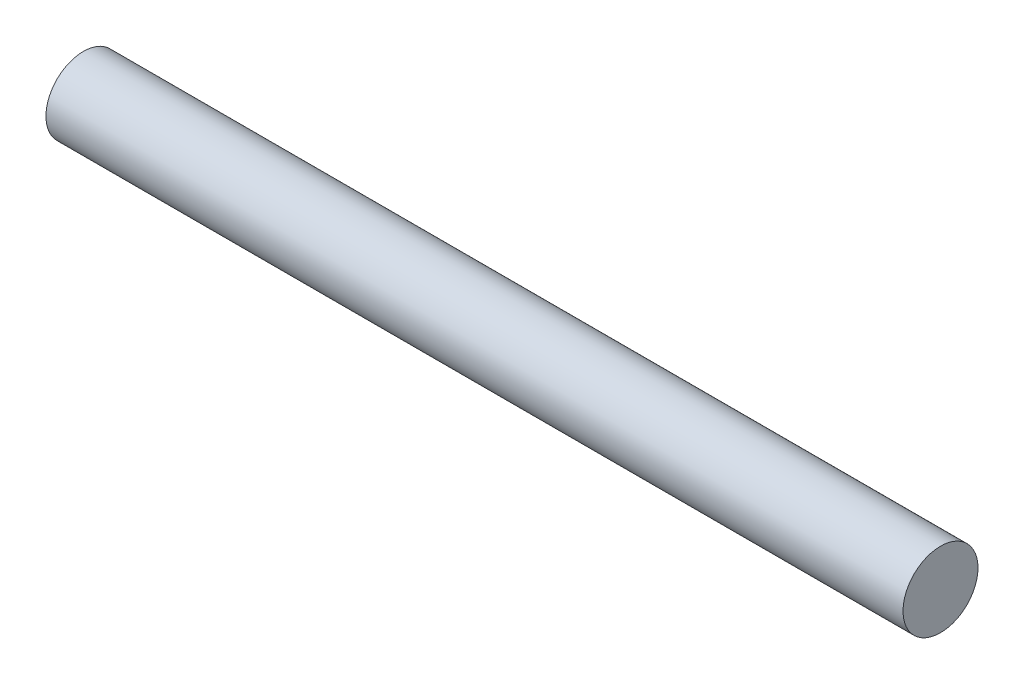
ISO-10303-21;
HEADER;
FILE_DESCRIPTION(('STEP AP214'),'2;1');
FILE_NAME('part.step','',(''),(''),'','','');
FILE_SCHEMA(('AUTOMOTIVE_DESIGN { 1 0 10303 214 1 1 1 1 }'));
ENDSEC;
DATA;
#1=APPLICATION_CONTEXT('core data for automotive mechanical design processes');
#2=APPLICATION_PROTOCOL_DEFINITION('international standard','automotive_design',2000,#1);
#3=PRODUCT_CONTEXT('',#1,'mechanical');
#4=PRODUCT('Part','Part','',(#3));
#5=PRODUCT_RELATED_PRODUCT_CATEGORY('part','',(#4));
#6=PRODUCT_DEFINITION_FORMATION('','',#4);
#7=PRODUCT_DEFINITION_CONTEXT('part definition',#1,'design');
#8=PRODUCT_DEFINITION('design','',#6,#7);
#9=PRODUCT_DEFINITION_SHAPE('','',#8);
#10=(LENGTH_UNIT() NAMED_UNIT(*) SI_UNIT(.MILLI.,.METRE.));
#11=(NAMED_UNIT(*) PLANE_ANGLE_UNIT() SI_UNIT($,.RADIAN.));
#12=(NAMED_UNIT(*) SI_UNIT($,.STERADIAN.) SOLID_ANGLE_UNIT());
#13=UNCERTAINTY_MEASURE_WITH_UNIT(LENGTH_MEASURE(1.E-05),#10,'distance_accuracy_value','');
#14=(GEOMETRIC_REPRESENTATION_CONTEXT(3) GLOBAL_UNCERTAINTY_ASSIGNED_CONTEXT((#13)) GLOBAL_UNIT_ASSIGNED_CONTEXT((#10,
#11,#12)) REPRESENTATION_CONTEXT('',''));
#15=CARTESIAN_POINT('',(0.,0.,0.));
#16=DIRECTION('',(0.,0.,1.));
#17=DIRECTION('',(1.,0.,0.));
#18=AXIS2_PLACEMENT_3D('',#15,#16,#17);
#19=CARTESIAN_POINT('',(57.15,0.,0.));
#20=DIRECTION('',(-1.,0.,0.));
#21=DIRECTION('',(0.,0.,1.));
#22=AXIS2_PLACEMENT_3D('',#19,#20,#21);
#23=CYLINDRICAL_SURFACE('',#22,2.5);
#24=CARTESIAN_POINT('',(57.15,0.,0.));
#25=DIRECTION('',(1.,0.,0.));
#26=DIRECTION('',(0.,0.,-1.));
#27=AXIS2_PLACEMENT_3D('',#24,#25,#26);
#28=CIRCLE('',#27,2.5);
#29=CARTESIAN_POINT('',(57.15,0.,-2.5));
#30=VERTEX_POINT('',#29);
#31=EDGE_CURVE('E10',#30,#30,#28,.T.);
#32=ORIENTED_EDGE('',*,*,#31,.F.);
#33=EDGE_LOOP('',(#32));
#34=FACE_BOUND('',#33,.T.);
#35=CARTESIAN_POINT('',(0.,0.,0.));
#36=DIRECTION('',(1.,0.,0.));
#37=DIRECTION('',(0.,0.,-1.));
#38=AXIS2_PLACEMENT_3D('',#35,#36,#37);
#39=CIRCLE('',#38,2.5);
#40=CARTESIAN_POINT('',(0.,0.,-2.5));
#41=VERTEX_POINT('',#40);
#42=EDGE_CURVE('E34',#41,#41,#39,.T.);
#43=ORIENTED_EDGE('',*,*,#42,.T.);
#44=EDGE_LOOP('',(#43));
#45=FACE_BOUND('',#44,.T.);
#46=ADVANCED_FACE('F31',(#34,#45),#23,.T.);
#47=CARTESIAN_POINT('',(57.15,0.,0.));
#48=DIRECTION('',(1.,0.,0.));
#49=DIRECTION('',(0.,0.,-1.));
#50=AXIS2_PLACEMENT_3D('',#47,#48,#49);
#51=PLANE('',#50);
#52=ORIENTED_EDGE('',*,*,#31,.T.);
#53=EDGE_LOOP('',(#52));
#54=FACE_BOUND('',#53,.T.);
#55=ADVANCED_FACE('F46',(#54),#51,.T.);
#56=CARTESIAN_POINT('',(0.,0.,0.));
#57=DIRECTION('',(1.,0.,0.));
#58=DIRECTION('',(0.,0.,-1.));
#59=AXIS2_PLACEMENT_3D('',#56,#57,#58);
#60=PLANE('',#59);
#61=ORIENTED_EDGE('',*,*,#42,.F.);
#62=EDGE_LOOP('',(#61));
#63=FACE_BOUND('',#62,.T.);
#64=ADVANCED_FACE('F44',(#63),#60,.F.);
#65=CLOSED_SHELL('',(#46,#55,#64));
#66=MANIFOLD_SOLID_BREP('B2',#65);
#67=ADVANCED_BREP_SHAPE_REPRESENTATION('',(#18,#66),#14);
#68=SHAPE_DEFINITION_REPRESENTATION(#9,#67);
ENDSEC;
END-ISO-10303-21;
